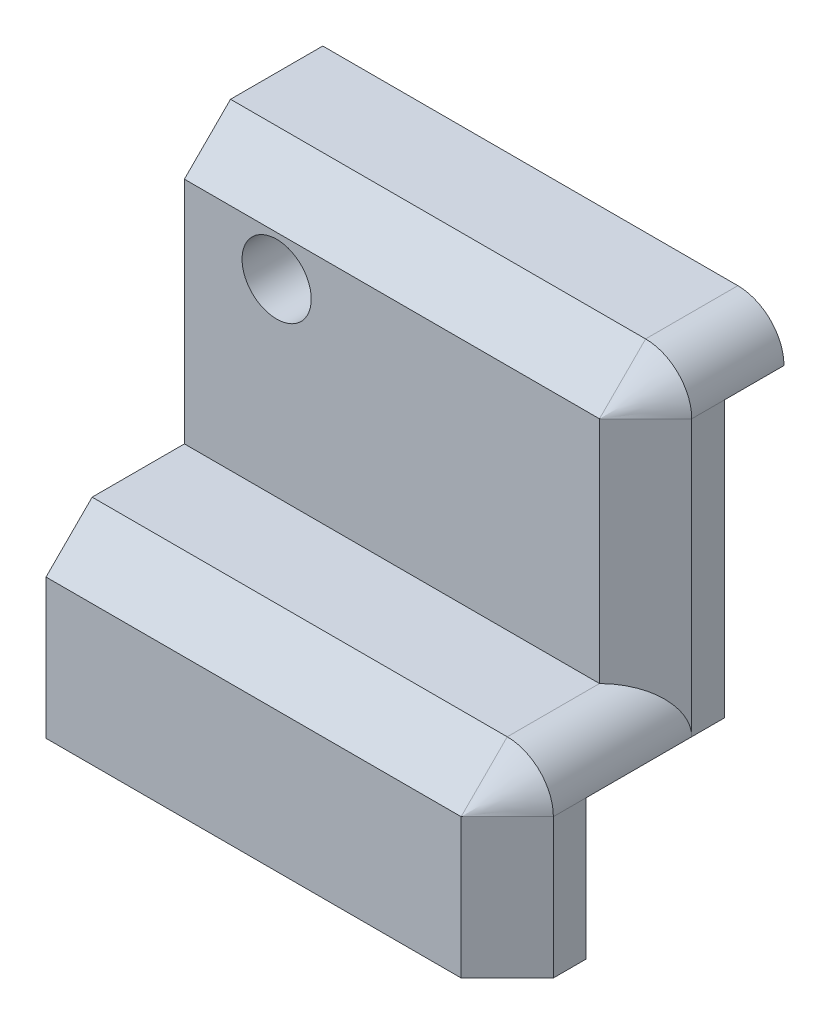
ISO-10303-21;
HEADER;
FILE_DESCRIPTION(('STEP AP214'),'2;1');
FILE_NAME('part.step','',(''),(''),'','','');
FILE_SCHEMA(('AUTOMOTIVE_DESIGN { 1 0 10303 214 1 1 1 1 }'));
ENDSEC;
DATA;
#1=APPLICATION_CONTEXT('core data for automotive mechanical design processes');
#2=APPLICATION_PROTOCOL_DEFINITION('international standard','automotive_design',2000,#1);
#3=PRODUCT_CONTEXT('',#1,'mechanical');
#4=PRODUCT('Part','Part','',(#3));
#5=PRODUCT_RELATED_PRODUCT_CATEGORY('part','',(#4));
#6=PRODUCT_DEFINITION_FORMATION('','',#4);
#7=PRODUCT_DEFINITION_CONTEXT('part definition',#1,'design');
#8=PRODUCT_DEFINITION('design','',#6,#7);
#9=PRODUCT_DEFINITION_SHAPE('','',#8);
#10=(LENGTH_UNIT() NAMED_UNIT(*) SI_UNIT(.MILLI.,.METRE.));
#11=(NAMED_UNIT(*) PLANE_ANGLE_UNIT() SI_UNIT($,.RADIAN.));
#12=(NAMED_UNIT(*) SI_UNIT($,.STERADIAN.) SOLID_ANGLE_UNIT());
#13=UNCERTAINTY_MEASURE_WITH_UNIT(LENGTH_MEASURE(1.E-05),#10,'distance_accuracy_value','');
#14=(GEOMETRIC_REPRESENTATION_CONTEXT(3) GLOBAL_UNCERTAINTY_ASSIGNED_CONTEXT((#13)) GLOBAL_UNIT_ASSIGNED_CONTEXT((#10,
#11,#12)) REPRESENTATION_CONTEXT('',''));
#15=CARTESIAN_POINT('',(0.,0.,0.));
#16=DIRECTION('',(0.,0.,1.));
#17=DIRECTION('',(1.,0.,0.));
#18=AXIS2_PLACEMENT_3D('',#15,#16,#17);
#19=CARTESIAN_POINT('',(0.,0.,30.));
#20=DIRECTION('',(0.,1.,0.));
#21=DIRECTION('',(0.,0.,1.));
#22=AXIS2_PLACEMENT_3D('',#19,#20,#21);
#23=PLANE('',#22);
#24=DIRECTION('',(0.707106781186547,0.,-0.707106781186549));
#25=VECTOR('',#24,1.);
#26=CARTESIAN_POINT('',(86.4644660940673,0.,56.4644660940673));
#27=LINE('',#26,#25);
#28=CARTESIAN_POINT('',(100.,0.,42.9289321881345));
#29=VERTEX_POINT('',#28);
#30=CARTESIAN_POINT('',(87.9289321881345,0.,55.));
#31=VERTEX_POINT('',#30);
#32=EDGE_CURVE('E383',#29,#31,#27,.F.);
#33=ORIENTED_EDGE('',*,*,#32,.F.);
#34=DIRECTION('',(0.,0.,-1.));
#35=VECTOR('',#34,1.);
#36=CARTESIAN_POINT('',(100.,0.,30.));
#37=LINE('',#36,#35);
#38=CARTESIAN_POINT('',(100.,0.,50.));
#39=VERTEX_POINT('',#38);
#40=EDGE_CURVE('E322',#39,#29,#37,.T.);
#41=ORIENTED_EDGE('',*,*,#40,.F.);
#42=DIRECTION('',(0.707106781186547,0.,-0.707106781186549));
#43=VECTOR('',#42,1.);
#44=CARTESIAN_POINT('',(90.,0.,60.));
#45=LINE('',#44,#43);
#46=CARTESIAN_POINT('',(90.,0.,60.));
#47=VERTEX_POINT('',#46);
#48=EDGE_CURVE('E254',#39,#47,#45,.F.);
#49=ORIENTED_EDGE('',*,*,#48,.T.);
#50=DIRECTION('',(1.,0.,0.));
#51=VECTOR('',#50,1.);
#52=CARTESIAN_POINT('',(0.,0.,60.));
#53=LINE('',#52,#51);
#54=CARTESIAN_POINT('',(0.,0.,60.));
#55=VERTEX_POINT('',#54);
#56=EDGE_CURVE('E303',#55,#47,#53,.T.);
#57=ORIENTED_EDGE('',*,*,#56,.F.);
#58=DIRECTION('',(0.,0.,-1.));
#59=VECTOR('',#58,1.);
#60=CARTESIAN_POINT('',(0.,0.,30.));
#61=LINE('',#60,#59);
#62=CARTESIAN_POINT('',(0.,0.,0.));
#63=VERTEX_POINT('',#62);
#64=EDGE_CURVE('E324',#55,#63,#61,.T.);
#65=ORIENTED_EDGE('',*,*,#64,.T.);
#66=DIRECTION('',(1.,0.,0.));
#67=VECTOR('',#66,1.);
#68=CARTESIAN_POINT('',(0.,0.,0.));
#69=LINE('',#68,#67);
#70=CARTESIAN_POINT('',(5.,0.,0.));
#71=VERTEX_POINT('',#70);
#72=EDGE_CURVE('E317',#63,#71,#69,.T.);
#73=ORIENTED_EDGE('',*,*,#72,.T.);
#74=DIRECTION('',(0.,0.,-1.));
#75=VECTOR('',#74,1.);
#76=CARTESIAN_POINT('',(5.,0.,30.));
#77=LINE('',#76,#75);
#78=CARTESIAN_POINT('',(5.,0.,55.));
#79=VERTEX_POINT('',#78);
#80=EDGE_CURVE('E62',#79,#71,#77,.T.);
#81=ORIENTED_EDGE('',*,*,#80,.F.);
#82=DIRECTION('',(1.,0.,0.));
#83=VECTOR('',#82,1.);
#84=CARTESIAN_POINT('',(0.,0.,55.));
#85=LINE('',#84,#83);
#86=EDGE_CURVE('E385',#79,#31,#85,.T.);
#87=ORIENTED_EDGE('',*,*,#86,.T.);
#88=EDGE_LOOP('',(#33,#41,#49,#57,#65,#73,#81,#87));
#89=FACE_BOUND('',#88,.T.);
#90=ADVANCED_FACE('F44',(#89),#23,.F.);
#91=CARTESIAN_POINT('',(100.,0.,30.));
#92=DIRECTION('',(-1.,0.,0.));
#93=DIRECTION('',(0.,0.,1.));
#94=AXIS2_PLACEMENT_3D('',#91,#92,#93);
#95=PLANE('',#94);
#96=DIRECTION('',(0.,1.,0.));
#97=VECTOR('',#96,1.);
#98=CARTESIAN_POINT('',(100.,0.,42.9289321881345));
#99=LINE('',#98,#97);
#100=CARTESIAN_POINT('',(100.,30.290520378338,42.9289321881345));
#101=VERTEX_POINT('',#100);
#102=EDGE_CURVE('E390',#101,#29,#99,.F.);
#103=ORIENTED_EDGE('',*,*,#102,.F.);
#104=DIRECTION('',(0.,0.,-1.));
#105=VECTOR('',#104,1.);
#106=CARTESIAN_POINT('',(100.,30.290520378338,30.));
#107=LINE('',#106,#105);
#108=CARTESIAN_POINT('',(100.,30.290520378338,50.));
#109=VERTEX_POINT('',#108);
#110=EDGE_CURVE('E236',#101,#109,#107,.F.);
#111=ORIENTED_EDGE('',*,*,#110,.T.);
#112=DIRECTION('',(0.,-1.,0.));
#113=VECTOR('',#112,1.);
#114=CARTESIAN_POINT('',(100.,0.,50.));
#115=LINE('',#114,#113);
#116=EDGE_CURVE('E252',#109,#39,#115,.T.);
#117=ORIENTED_EDGE('',*,*,#116,.T.);
#118=ORIENTED_EDGE('',*,*,#40,.T.);
#119=EDGE_LOOP('',(#103,#111,#117,#118));
#120=FACE_BOUND('',#119,.T.);
#121=ADVANCED_FACE('F380',(#120),#95,.F.);
#122=DIRECTION('',(0.,0.,-1.));
#123=VECTOR('',#122,1.);
#124=CARTESIAN_POINT('',(100.,30.290520378338,30.));
#125=LINE('',#124,#123);
#126=CARTESIAN_POINT('',(100.,30.290520378338,12.9289321881345));
#127=VERTEX_POINT('',#126);
#128=CARTESIAN_POINT('',(100.,30.290520378338,20.));
#129=VERTEX_POINT('',#128);
#130=EDGE_CURVE('E352',#127,#129,#125,.F.);
#131=ORIENTED_EDGE('',*,*,#130,.F.);
#132=DIRECTION('',(0.,1.,0.));
#133=VECTOR('',#132,1.);
#134=CARTESIAN_POINT('',(100.,0.,12.9289321881345));
#135=LINE('',#134,#133);
#136=CARTESIAN_POINT('',(100.,90.,12.9289321881345));
#137=VERTEX_POINT('',#136);
#138=EDGE_CURVE('E353',#137,#127,#135,.F.);
#139=ORIENTED_EDGE('',*,*,#138,.F.);
#140=DIRECTION('',(0.,0.,-1.));
#141=VECTOR('',#140,1.);
#142=CARTESIAN_POINT('',(100.,90.,30.));
#143=LINE('',#142,#141);
#144=CARTESIAN_POINT('',(100.,90.,20.));
#145=VERTEX_POINT('',#144);
#146=EDGE_CURVE('E235',#137,#145,#143,.F.);
#147=ORIENTED_EDGE('',*,*,#146,.T.);
#148=DIRECTION('',(0.,-1.,0.));
#149=VECTOR('',#148,1.);
#150=CARTESIAN_POINT('',(100.,0.,20.));
#151=LINE('',#150,#149);
#152=EDGE_CURVE('E249',#145,#129,#151,.T.);
#153=ORIENTED_EDGE('',*,*,#152,.T.);
#154=EDGE_LOOP('',(#131,#139,#147,#153));
#155=FACE_BOUND('',#154,.T.);
#156=ADVANCED_FACE('F350',(#155),#95,.F.);
#157=CARTESIAN_POINT('',(0.,0.,0.));
#158=DIRECTION('',(0.,0.,-1.));
#159=DIRECTION('',(-1.,0.,0.));
#160=AXIS2_PLACEMENT_3D('',#157,#158,#159);
#161=PLANE('',#160);
#162=CARTESIAN_POINT('',(20.,81.2240100063522,0.));
#163=DIRECTION('',(0.,0.,-1.));
#164=DIRECTION('',(-1.,0.,0.));
#165=AXIS2_PLACEMENT_3D('',#162,#163,#164);
#166=CIRCLE('',#165,12.5);
#167=CARTESIAN_POINT('',(7.5,81.2240100063522,0.));
#168=VERTEX_POINT('',#167);
#169=EDGE_CURVE('E403',#168,#168,#166,.F.);
#170=ORIENTED_EDGE('',*,*,#169,.F.);
#171=EDGE_LOOP('',(#170));
#172=FACE_BOUND('',#171,.T.);
#173=CARTESIAN_POINT('',(20.,81.2240100063522,0.));
#174=DIRECTION('',(0.,0.,1.));
#175=DIRECTION('',(1.,0.,0.));
#176=AXIS2_PLACEMENT_3D('',#173,#174,#175);
#177=CIRCLE('',#176,7.5);
#178=CARTESIAN_POINT('',(27.5,81.2240100063522,0.));
#179=VERTEX_POINT('',#178);
#180=EDGE_CURVE('E295',#179,#179,#177,.T.);
#181=ORIENTED_EDGE('',*,*,#180,.T.);
#182=EDGE_LOOP('',(#181));
#183=FACE_BOUND('',#182,.T.);
#184=ADVANCED_FACE('F629',(#172,#183),#161,.T.);
#185=CARTESIAN_POINT('',(0.,0.,30.));
#186=DIRECTION('',(0.,0.,-1.));
#187=DIRECTION('',(-1.,0.,0.));
#188=AXIS2_PLACEMENT_3D('',#185,#186,#187);
#189=PLANE('',#188);
#190=CARTESIAN_POINT('',(20.,81.2240100063522,30.));
#191=DIRECTION('',(0.,0.,1.));
#192=DIRECTION('',(1.,0.,0.));
#193=AXIS2_PLACEMENT_3D('',#190,#191,#192);
#194=CIRCLE('',#193,7.5);
#195=CARTESIAN_POINT('',(27.5,81.2240100063522,30.));
#196=VERTEX_POINT('',#195);
#197=EDGE_CURVE('E277',#196,#196,#194,.T.);
#198=ORIENTED_EDGE('',*,*,#197,.F.);
#199=EDGE_LOOP('',(#198));
#200=FACE_BOUND('',#199,.T.);
#201=DIRECTION('',(-1.,0.,0.));
#202=VECTOR('',#201,1.);
#203=CARTESIAN_POINT('',(0.,40.290520378338,30.));
#204=LINE('',#203,#202);
#205=CARTESIAN_POINT('',(90.,40.290520378338,30.));
#206=VERTEX_POINT('',#205);
#207=CARTESIAN_POINT('',(0.,40.290520378338,30.));
#208=VERTEX_POINT('',#207);
#209=EDGE_CURVE('E298',#206,#208,#204,.T.);
#210=ORIENTED_EDGE('',*,*,#209,.F.);
#211=DIRECTION('',(0.,1.,0.));
#212=VECTOR('',#211,1.);
#213=CARTESIAN_POINT('',(90.,0.,30.));
#214=LINE('',#213,#212);
#215=CARTESIAN_POINT('',(90.,90.,30.));
#216=VERTEX_POINT('',#215);
#217=EDGE_CURVE('E267',#206,#216,#214,.T.);
#218=ORIENTED_EDGE('',*,*,#217,.T.);
#219=DIRECTION('',(-1.,0.,0.));
#220=VECTOR('',#219,1.);
#221=CARTESIAN_POINT('',(0.,90.,30.));
#222=LINE('',#221,#220);
#223=CARTESIAN_POINT('',(0.,90.,30.));
#224=VERTEX_POINT('',#223);
#225=EDGE_CURVE('E265',#216,#224,#222,.T.);
#226=ORIENTED_EDGE('',*,*,#225,.T.);
#227=DIRECTION('',(0.,-1.,0.));
#228=VECTOR('',#227,1.);
#229=CARTESIAN_POINT('',(0.,0.,30.));
#230=LINE('',#229,#228);
#231=EDGE_CURVE('E312',#224,#208,#230,.T.);
#232=ORIENTED_EDGE('',*,*,#231,.T.);
#233=EDGE_LOOP('',(#210,#218,#226,#232));
#234=FACE_BOUND('',#233,.T.);
#235=ADVANCED_FACE('F339',(#200,#234),#189,.F.);
#236=CARTESIAN_POINT('',(0.,0.,30.));
#237=DIRECTION('',(1.,0.,0.));
#238=DIRECTION('',(0.,0.,-1.));
#239=AXIS2_PLACEMENT_3D('',#236,#237,#238);
#240=PLANE('',#239);
#241=DIRECTION('',(0.,-1.,0.));
#242=VECTOR('',#241,1.);
#243=CARTESIAN_POINT('',(0.,0.,60.));
#244=LINE('',#243,#242);
#245=CARTESIAN_POINT('',(0.,30.290520378338,60.));
#246=VERTEX_POINT('',#245);
#247=EDGE_CURVE('E301',#246,#55,#244,.T.);
#248=ORIENTED_EDGE('',*,*,#247,.F.);
#249=DIRECTION('',(0.,-0.707106781186547,0.707106781186549));
#250=VECTOR('',#249,1.);
#251=CARTESIAN_POINT('',(0.,30.290520378338,60.));
#252=LINE('',#251,#250);
#253=CARTESIAN_POINT('',(0.,40.290520378338,50.));
#254=VERTEX_POINT('',#253);
#255=EDGE_CURVE('E261',#246,#254,#252,.F.);
#256=ORIENTED_EDGE('',*,*,#255,.T.);
#257=DIRECTION('',(0.,0.,-1.));
#258=VECTOR('',#257,1.);
#259=CARTESIAN_POINT('',(0.,40.290520378338,60.));
#260=LINE('',#259,#258);
#261=EDGE_CURVE('E306',#254,#208,#260,.T.);
#262=ORIENTED_EDGE('',*,*,#261,.T.);
#263=ORIENTED_EDGE('',*,*,#231,.F.);
#264=DIRECTION('',(0.,-0.707106781186546,0.70710678118655));
#265=VECTOR('',#264,1.);
#266=CARTESIAN_POINT('',(0.,90.,30.));
#267=LINE('',#266,#265);
#268=CARTESIAN_POINT('',(0.,100.,20.));
#269=VERTEX_POINT('',#268);
#270=EDGE_CURVE('E259',#224,#269,#267,.F.);
#271=ORIENTED_EDGE('',*,*,#270,.T.);
#272=DIRECTION('',(0.,0.,-1.));
#273=VECTOR('',#272,1.);
#274=CARTESIAN_POINT('',(0.,100.,30.));
#275=LINE('',#274,#273);
#276=CARTESIAN_POINT('',(0.,100.,0.));
#277=VERTEX_POINT('',#276);
#278=EDGE_CURVE('E314',#269,#277,#275,.T.);
#279=ORIENTED_EDGE('',*,*,#278,.T.);
#280=DIRECTION('',(0.,-1.,0.));
#281=VECTOR('',#280,1.);
#282=CARTESIAN_POINT('',(0.,0.,0.));
#283=LINE('',#282,#281);
#284=EDGE_CURVE('E311',#277,#63,#283,.T.);
#285=ORIENTED_EDGE('',*,*,#284,.T.);
#286=ORIENTED_EDGE('',*,*,#64,.F.);
#287=EDGE_LOOP('',(#248,#256,#262,#263,#271,#279,#285,#286));
#288=FACE_BOUND('',#287,.T.);
#289=ADVANCED_FACE('F363',(#288),#240,.F.);
#290=CARTESIAN_POINT('',(0.,100.,30.));
#291=DIRECTION('',(0.,-1.,0.));
#292=DIRECTION('',(0.,0.,-1.));
#293=AXIS2_PLACEMENT_3D('',#290,#291,#292);
#294=PLANE('',#293);
#295=ORIENTED_EDGE('',*,*,#278,.F.);
#296=DIRECTION('',(1.,0.,0.));
#297=VECTOR('',#296,1.);
#298=CARTESIAN_POINT('',(0.,100.,20.));
#299=LINE('',#298,#297);
#300=CARTESIAN_POINT('',(90.,100.,20.));
#301=VERTEX_POINT('',#300);
#302=EDGE_CURVE('E54',#269,#301,#299,.T.);
#303=ORIENTED_EDGE('',*,*,#302,.T.);
#304=DIRECTION('',(0.,0.,-1.));
#305=VECTOR('',#304,1.);
#306=CARTESIAN_POINT('',(90.,100.,30.));
#307=LINE('',#306,#305);
#308=CARTESIAN_POINT('',(90.,100.,0.));
#309=VERTEX_POINT('',#308);
#310=EDGE_CURVE('E230',#301,#309,#307,.T.);
#311=ORIENTED_EDGE('',*,*,#310,.T.);
#312=DIRECTION('',(-1.,0.,0.));
#313=VECTOR('',#312,1.);
#314=CARTESIAN_POINT('',(0.,100.,0.));
#315=LINE('',#314,#313);
#316=EDGE_CURVE('E227',#309,#277,#315,.T.);
#317=ORIENTED_EDGE('',*,*,#316,.T.);
#318=EDGE_LOOP('',(#295,#303,#311,#317));
#319=FACE_BOUND('',#318,.T.);
#320=ADVANCED_FACE('F544',(#319),#294,.F.);
#321=DIRECTION('',(-1.,0.,0.));
#322=VECTOR('',#321,1.);
#323=CARTESIAN_POINT('',(100.,90.,0.));
#324=LINE('',#323,#322);
#325=CARTESIAN_POINT('',(95.,90.,0.));
#326=VERTEX_POINT('',#325);
#327=CARTESIAN_POINT('',(100.,90.,0.));
#328=VERTEX_POINT('',#327);
#329=EDGE_CURVE('E208',#326,#328,#324,.F.);
#330=ORIENTED_EDGE('',*,*,#329,.F.);
#331=CARTESIAN_POINT('',(90.,90.,0.));
#332=DIRECTION('',(0.,0.,-1.));
#333=DIRECTION('',(-1.,0.,0.));
#334=AXIS2_PLACEMENT_3D('',#331,#332,#333);
#335=CIRCLE('',#334,5.);
#336=CARTESIAN_POINT('',(90.,95.,0.));
#337=VERTEX_POINT('',#336);
#338=EDGE_CURVE('E445',#337,#326,#335,.T.);
#339=ORIENTED_EDGE('',*,*,#338,.F.);
#340=DIRECTION('',(-1.,0.,0.));
#341=VECTOR('',#340,1.);
#342=CARTESIAN_POINT('',(0.,95.,0.));
#343=LINE('',#342,#341);
#344=CARTESIAN_POINT('',(5.,95.,0.));
#345=VERTEX_POINT('',#344);
#346=EDGE_CURVE('E430',#337,#345,#343,.T.);
#347=ORIENTED_EDGE('',*,*,#346,.T.);
#348=DIRECTION('',(0.,-1.,0.));
#349=VECTOR('',#348,1.);
#350=CARTESIAN_POINT('',(5.,0.,0.));
#351=LINE('',#350,#349);
#352=EDGE_CURVE('E437',#345,#71,#351,.T.);
#353=ORIENTED_EDGE('',*,*,#352,.T.);
#354=ORIENTED_EDGE('',*,*,#72,.F.);
#355=ORIENTED_EDGE('',*,*,#284,.F.);
#356=ORIENTED_EDGE('',*,*,#316,.F.);
#357=CARTESIAN_POINT('',(90.,90.,0.));
#358=DIRECTION('',(0.,0.,-1.));
#359=DIRECTION('',(-1.,0.,0.));
#360=AXIS2_PLACEMENT_3D('',#357,#358,#359);
#361=CIRCLE('',#360,10.);
#362=EDGE_CURVE('E223',#309,#328,#361,.T.);
#363=ORIENTED_EDGE('',*,*,#362,.T.);
#364=EDGE_LOOP('',(#330,#339,#347,#353,#354,#355,#356,#363));
#365=FACE_BOUND('',#364,.T.);
#366=ADVANCED_FACE('F224',(#365),#161,.T.);
#367=CARTESIAN_POINT('',(0.,40.290520378338,60.));
#368=DIRECTION('',(0.,-1.,0.));
#369=DIRECTION('',(0.,0.,-1.));
#370=AXIS2_PLACEMENT_3D('',#367,#368,#369);
#371=PLANE('',#370);
#372=ORIENTED_EDGE('',*,*,#261,.F.);
#373=DIRECTION('',(1.,0.,0.));
#374=VECTOR('',#373,1.);
#375=CARTESIAN_POINT('',(0.,40.290520378338,50.));
#376=LINE('',#375,#374);
#377=CARTESIAN_POINT('',(90.,40.290520378338,50.));
#378=VERTEX_POINT('',#377);
#379=EDGE_CURVE('E263',#254,#378,#376,.T.);
#380=ORIENTED_EDGE('',*,*,#379,.T.);
#381=DIRECTION('',(0.,0.,-1.));
#382=VECTOR('',#381,1.);
#383=CARTESIAN_POINT('',(90.,40.290520378338,60.));
#384=LINE('',#383,#382);
#385=EDGE_CURVE('E240',#378,#206,#384,.T.);
#386=ORIENTED_EDGE('',*,*,#385,.T.);
#387=ORIENTED_EDGE('',*,*,#209,.T.);
#388=EDGE_LOOP('',(#372,#380,#386,#387));
#389=FACE_BOUND('',#388,.T.);
#390=ADVANCED_FACE('F334',(#389),#371,.F.);
#391=CARTESIAN_POINT('',(0.,0.,60.));
#392=DIRECTION('',(0.,0.,-1.));
#393=DIRECTION('',(-1.,0.,0.));
#394=AXIS2_PLACEMENT_3D('',#391,#392,#393);
#395=PLANE('',#394);
#396=ORIENTED_EDGE('',*,*,#56,.T.);
#397=DIRECTION('',(0.,1.,0.));
#398=VECTOR('',#397,1.);
#399=CARTESIAN_POINT('',(90.,0.,60.));
#400=LINE('',#399,#398);
#401=CARTESIAN_POINT('',(90.,30.290520378338,60.));
#402=VERTEX_POINT('',#401);
#403=EDGE_CURVE('E246',#47,#402,#400,.T.);
#404=ORIENTED_EDGE('',*,*,#403,.T.);
#405=DIRECTION('',(-1.,0.,0.));
#406=VECTOR('',#405,1.);
#407=CARTESIAN_POINT('',(0.,30.290520378338,60.));
#408=LINE('',#407,#406);
#409=EDGE_CURVE('E229',#402,#246,#408,.T.);
#410=ORIENTED_EDGE('',*,*,#409,.T.);
#411=ORIENTED_EDGE('',*,*,#247,.T.);
#412=EDGE_LOOP('',(#396,#404,#410,#411));
#413=FACE_BOUND('',#412,.T.);
#414=ADVANCED_FACE('F607',(#413),#395,.F.);
#415=CARTESIAN_POINT('',(20.,81.2240100063522,0.));
#416=DIRECTION('',(0.,0.,1.));
#417=DIRECTION('',(1.,0.,0.));
#418=AXIS2_PLACEMENT_3D('',#415,#416,#417);
#419=CYLINDRICAL_SURFACE('',#418,7.5);
#420=ORIENTED_EDGE('',*,*,#180,.F.);
#421=EDGE_LOOP('',(#420));
#422=FACE_BOUND('',#421,.T.);
#423=ORIENTED_EDGE('',*,*,#197,.T.);
#424=EDGE_LOOP('',(#423));
#425=FACE_BOUND('',#424,.T.);
#426=ADVANCED_FACE('F547',(#422,#425),#419,.F.);
#427=CARTESIAN_POINT('',(90.,30.290520378338,60.));
#428=DIRECTION('',(0.,0.,-1.));
#429=DIRECTION('',(-1.,0.,0.));
#430=AXIS2_PLACEMENT_3D('',#427,#428,#429);
#431=CYLINDRICAL_SURFACE('',#430,10.);
#432=ORIENTED_EDGE('',*,*,#385,.F.);
#433=CARTESIAN_POINT('',(90.,30.290520378338,50.));
#434=DIRECTION('',(0.,0.,-1.));
#435=DIRECTION('',(-1.,0.,0.));
#436=AXIS2_PLACEMENT_3D('',#433,#434,#435);
#437=CIRCLE('',#436,10.);
#438=EDGE_CURVE('E256',#378,#109,#437,.T.);
#439=ORIENTED_EDGE('',*,*,#438,.T.);
#440=ORIENTED_EDGE('',*,*,#110,.F.);
#441=EDGE_CURVE('E238',#129,#101,#107,.F.);
#442=ORIENTED_EDGE('',*,*,#441,.F.);
#443=CARTESIAN_POINT('',(90.,30.290520378338,30.));
#444=DIRECTION('',(-0.70710678118655,0.,-0.707106781186546));
#445=DIRECTION('',(0.707106781186546,0.,-0.70710678118655));
#446=AXIS2_PLACEMENT_3D('',#443,#444,#445);
#447=ELLIPSE('',#446,14.142135623731,10.);
#448=EDGE_CURVE('E11',#129,#206,#447,.F.);
#449=ORIENTED_EDGE('',*,*,#448,.T.);
#450=EDGE_LOOP('',(#432,#439,#440,#442,#449));
#451=FACE_BOUND('',#450,.T.);
#452=ADVANCED_FACE('F344',(#451),#431,.T.);
#453=CARTESIAN_POINT('',(90.,90.,30.));
#454=DIRECTION('',(0.,0.,-1.));
#455=DIRECTION('',(-1.,0.,0.));
#456=AXIS2_PLACEMENT_3D('',#453,#454,#455);
#457=CYLINDRICAL_SURFACE('',#456,10.);
#458=ORIENTED_EDGE('',*,*,#310,.F.);
#459=CARTESIAN_POINT('',(90.,90.,20.));
#460=DIRECTION('',(0.,0.,-1.));
#461=DIRECTION('',(-1.,0.,0.));
#462=AXIS2_PLACEMENT_3D('',#459,#460,#461);
#463=CIRCLE('',#462,10.);
#464=EDGE_CURVE('E270',#301,#145,#463,.T.);
#465=ORIENTED_EDGE('',*,*,#464,.T.);
#466=ORIENTED_EDGE('',*,*,#146,.F.);
#467=EDGE_CURVE('E212',#328,#137,#143,.F.);
#468=ORIENTED_EDGE('',*,*,#467,.F.);
#469=ORIENTED_EDGE('',*,*,#362,.F.);
#470=EDGE_LOOP('',(#458,#465,#466,#468,#469));
#471=FACE_BOUND('',#470,.T.);
#472=ADVANCED_FACE('F233',(#471),#457,.T.);
#473=CARTESIAN_POINT('',(0.,30.290520378338,60.));
#474=DIRECTION('',(0.,-0.707106781186548,-0.707106781186546));
#475=DIRECTION('',(-1.,0.,0.));
#476=AXIS2_PLACEMENT_3D('',#473,#474,#475);
#477=PLANE('',#476);
#478=DIRECTION('',(0.,-0.707106781186546,0.707106781186548));
#479=VECTOR('',#478,1.);
#480=CARTESIAN_POINT('',(90.,40.290520378338,50.));
#481=LINE('',#480,#479);
#482=EDGE_CURVE('E275',#378,#402,#481,.T.);
#483=ORIENTED_EDGE('',*,*,#482,.F.);
#484=ORIENTED_EDGE('',*,*,#379,.F.);
#485=ORIENTED_EDGE('',*,*,#255,.F.);
#486=ORIENTED_EDGE('',*,*,#409,.F.);
#487=EDGE_LOOP('',(#483,#484,#485,#486));
#488=FACE_BOUND('',#487,.T.);
#489=ADVANCED_FACE('F366',(#488),#477,.F.);
#490=CARTESIAN_POINT('',(90.,30.290520378338,50.));
#491=DIRECTION('',(0.,0.,-1.));
#492=DIRECTION('',(-1.,0.,0.));
#493=AXIS2_PLACEMENT_3D('',#490,#491,#492);
#494=CONICAL_SURFACE('',#493,9.99999999999999,0.785398163397447);
#495=ORIENTED_EDGE('',*,*,#438,.F.);
#496=ORIENTED_EDGE('',*,*,#482,.T.);
#497=DIRECTION('',(-0.707106781186546,0.,0.707106781186548));
#498=VECTOR('',#497,1.);
#499=CARTESIAN_POINT('',(100.,30.290520378338,50.));
#500=LINE('',#499,#498);
#501=EDGE_CURVE('E273',#109,#402,#500,.T.);
#502=ORIENTED_EDGE('',*,*,#501,.F.);
#503=EDGE_LOOP('',(#495,#496,#502));
#504=FACE_BOUND('',#503,.T.);
#505=ADVANCED_FACE('F371',(#504),#494,.T.);
#506=CARTESIAN_POINT('',(90.,0.,60.));
#507=DIRECTION('',(-0.707106781186548,0.,-0.707106781186546));
#508=DIRECTION('',(0.,1.,0.));
#509=AXIS2_PLACEMENT_3D('',#506,#507,#508);
#510=PLANE('',#509);
#511=ORIENTED_EDGE('',*,*,#48,.F.);
#512=ORIENTED_EDGE('',*,*,#116,.F.);
#513=ORIENTED_EDGE('',*,*,#501,.T.);
#514=ORIENTED_EDGE('',*,*,#403,.F.);
#515=EDGE_LOOP('',(#511,#512,#513,#514));
#516=FACE_BOUND('',#515,.T.);
#517=ADVANCED_FACE('F375',(#516),#510,.F.);
#518=CARTESIAN_POINT('',(0.,90.,30.));
#519=DIRECTION('',(0.,-0.70710678118655,-0.707106781186546));
#520=DIRECTION('',(-1.,0.,0.));
#521=AXIS2_PLACEMENT_3D('',#518,#519,#520);
#522=PLANE('',#521);
#523=DIRECTION('',(0.,-0.707106781186546,0.70710678118655));
#524=VECTOR('',#523,1.);
#525=CARTESIAN_POINT('',(90.,100.,20.));
#526=LINE('',#525,#524);
#527=EDGE_CURVE('E49',#301,#216,#526,.T.);
#528=ORIENTED_EDGE('',*,*,#527,.F.);
#529=ORIENTED_EDGE('',*,*,#302,.F.);
#530=ORIENTED_EDGE('',*,*,#270,.F.);
#531=ORIENTED_EDGE('',*,*,#225,.F.);
#532=EDGE_LOOP('',(#528,#529,#530,#531));
#533=FACE_BOUND('',#532,.T.);
#534=ADVANCED_FACE('F47',(#533),#522,.F.);
#535=CARTESIAN_POINT('',(90.,90.,20.));
#536=DIRECTION('',(0.,0.,-1.));
#537=DIRECTION('',(-1.,0.,0.));
#538=AXIS2_PLACEMENT_3D('',#535,#536,#537);
#539=CONICAL_SURFACE('',#538,9.99999999999999,0.785398163397446);
#540=ORIENTED_EDGE('',*,*,#464,.F.);
#541=ORIENTED_EDGE('',*,*,#527,.T.);
#542=DIRECTION('',(-0.707106781186546,0.,0.70710678118655));
#543=VECTOR('',#542,1.);
#544=CARTESIAN_POINT('',(100.,90.,20.));
#545=LINE('',#544,#543);
#546=EDGE_CURVE('E278',#145,#216,#545,.T.);
#547=ORIENTED_EDGE('',*,*,#546,.F.);
#548=EDGE_LOOP('',(#540,#541,#547));
#549=FACE_BOUND('',#548,.T.);
#550=ADVANCED_FACE('F357',(#549),#539,.T.);
#551=CARTESIAN_POINT('',(90.,0.,30.));
#552=DIRECTION('',(-0.70710678118655,0.,-0.707106781186546));
#553=DIRECTION('',(0.,1.,0.));
#554=AXIS2_PLACEMENT_3D('',#551,#552,#553);
#555=PLANE('',#554);
#556=ORIENTED_EDGE('',*,*,#448,.F.);
#557=ORIENTED_EDGE('',*,*,#152,.F.);
#558=ORIENTED_EDGE('',*,*,#546,.T.);
#559=ORIENTED_EDGE('',*,*,#217,.F.);
#560=EDGE_LOOP('',(#556,#557,#558,#559));
#561=FACE_BOUND('',#560,.T.);
#562=ADVANCED_FACE('F342',(#561),#555,.F.);
#563=CARTESIAN_POINT('',(100.,90.,30.));
#564=DIRECTION('',(0.,1.,0.));
#565=DIRECTION('',(0.,0.,-1.));
#566=AXIS2_PLACEMENT_3D('',#563,#564,#565);
#567=PLANE('',#566);
#568=ORIENTED_EDGE('',*,*,#467,.T.);
#569=DIRECTION('',(-0.707106781186546,0.,0.70710678118655));
#570=VECTOR('',#569,1.);
#571=CARTESIAN_POINT('',(91.4644660940672,90.,21.4644660940673));
#572=LINE('',#571,#570);
#573=CARTESIAN_POINT('',(95.,90.,17.9289321881345));
#574=VERTEX_POINT('',#573);
#575=EDGE_CURVE('E219',#574,#137,#572,.F.);
#576=ORIENTED_EDGE('',*,*,#575,.F.);
#577=DIRECTION('',(0.,0.,-1.));
#578=VECTOR('',#577,1.);
#579=CARTESIAN_POINT('',(95.,90.,30.));
#580=LINE('',#579,#578);
#581=EDGE_CURVE('E215',#326,#574,#580,.F.);
#582=ORIENTED_EDGE('',*,*,#581,.F.);
#583=ORIENTED_EDGE('',*,*,#329,.T.);
#584=EDGE_LOOP('',(#568,#576,#582,#583));
#585=FACE_BOUND('',#584,.T.);
#586=ADVANCED_FACE('F210',(#585),#567,.F.);
#587=CARTESIAN_POINT('',(100.,30.290520378338,30.));
#588=DIRECTION('',(0.,1.,0.));
#589=DIRECTION('',(0.,0.,-1.));
#590=AXIS2_PLACEMENT_3D('',#587,#588,#589);
#591=PLANE('',#590);
#592=ORIENTED_EDGE('',*,*,#130,.T.);
#593=ORIENTED_EDGE('',*,*,#441,.T.);
#594=DIRECTION('',(-0.707106781186547,0.,0.707106781186549));
#595=VECTOR('',#594,1.);
#596=CARTESIAN_POINT('',(106.464466094067,30.290520378338,36.4644660940672));
#597=LINE('',#596,#595);
#598=CARTESIAN_POINT('',(95.,30.290520378338,47.9289321881345));
#599=VERTEX_POINT('',#598);
#600=EDGE_CURVE('E474',#599,#101,#597,.F.);
#601=ORIENTED_EDGE('',*,*,#600,.F.);
#602=DIRECTION('',(0.,0.,-1.));
#603=VECTOR('',#602,1.);
#604=CARTESIAN_POINT('',(95.,30.290520378338,60.));
#605=LINE('',#604,#603);
#606=CARTESIAN_POINT('',(95.,30.290520378338,17.9289321881345));
#607=VERTEX_POINT('',#606);
#608=EDGE_CURVE('E456',#607,#599,#605,.F.);
#609=ORIENTED_EDGE('',*,*,#608,.F.);
#610=DIRECTION('',(-0.707106781186546,0.,0.70710678118655));
#611=VECTOR('',#610,1.);
#612=CARTESIAN_POINT('',(91.4644660940672,30.290520378338,21.4644660940673));
#613=LINE('',#612,#611);
#614=EDGE_CURVE('E476',#607,#127,#613,.F.);
#615=ORIENTED_EDGE('',*,*,#614,.T.);
#616=EDGE_LOOP('',(#592,#593,#601,#609,#615));
#617=FACE_BOUND('',#616,.T.);
#618=ADVANCED_FACE('F484',(#617),#591,.F.);
#619=CARTESIAN_POINT('',(0.,0.,25.));
#620=DIRECTION('',(0.,0.,-1.));
#621=DIRECTION('',(-1.,0.,0.));
#622=AXIS2_PLACEMENT_3D('',#619,#620,#621);
#623=PLANE('',#622);
#624=DIRECTION('',(1.,0.,0.));
#625=VECTOR('',#624,1.);
#626=CARTESIAN_POINT('',(0.,87.9289321881345,25.));
#627=LINE('',#626,#625);
#628=CARTESIAN_POINT('',(87.9289321881345,87.9289321881345,25.));
#629=VERTEX_POINT('',#628);
#630=CARTESIAN_POINT('',(30.5495980272351,87.9289321881345,25.));
#631=VERTEX_POINT('',#630);
#632=EDGE_CURVE('E425',#629,#631,#627,.F.);
#633=ORIENTED_EDGE('',*,*,#632,.F.);
#634=DIRECTION('',(0.,-1.,0.));
#635=VECTOR('',#634,1.);
#636=CARTESIAN_POINT('',(87.9289321881345,0.,25.));
#637=LINE('',#636,#635);
#638=CARTESIAN_POINT('',(87.9289321881345,35.290520378338,25.));
#639=VERTEX_POINT('',#638);
#640=EDGE_CURVE('E421',#639,#629,#637,.F.);
#641=ORIENTED_EDGE('',*,*,#640,.F.);
#642=DIRECTION('',(-1.,0.,0.));
#643=VECTOR('',#642,1.);
#644=CARTESIAN_POINT('',(0.,35.290520378338,25.));
#645=LINE('',#644,#643);
#646=CARTESIAN_POINT('',(5.,35.290520378338,25.));
#647=VERTEX_POINT('',#646);
#648=EDGE_CURVE('E405',#639,#647,#645,.T.);
#649=ORIENTED_EDGE('',*,*,#648,.T.);
#650=DIRECTION('',(0.,-1.,0.));
#651=VECTOR('',#650,1.);
#652=CARTESIAN_POINT('',(5.,0.,25.));
#653=LINE('',#652,#651);
#654=CARTESIAN_POINT('',(5.,87.9289321881345,25.));
#655=VERTEX_POINT('',#654);
#656=EDGE_CURVE('E428',#655,#647,#653,.T.);
#657=ORIENTED_EDGE('',*,*,#656,.F.);
#658=CARTESIAN_POINT('',(9.45040197276485,87.9289321881345,25.));
#659=VERTEX_POINT('',#658);
#660=EDGE_CURVE('E427',#659,#655,#627,.F.);
#661=ORIENTED_EDGE('',*,*,#660,.F.);
#662=CARTESIAN_POINT('',(20.,81.2240100063522,25.));
#663=DIRECTION('',(0.,0.,-1.));
#664=DIRECTION('',(-1.,0.,0.));
#665=AXIS2_PLACEMENT_3D('',#662,#663,#664);
#666=CIRCLE('',#665,12.5);
#667=EDGE_CURVE('E406',#659,#631,#666,.F.);
#668=ORIENTED_EDGE('',*,*,#667,.T.);
#669=EDGE_LOOP('',(#633,#641,#649,#657,#661,#668));
#670=FACE_BOUND('',#669,.T.);
#671=ADVANCED_FACE('F522',(#670),#623,.T.);
#672=CARTESIAN_POINT('',(5.,0.,30.));
#673=DIRECTION('',(1.,0.,0.));
#674=DIRECTION('',(0.,0.,-1.));
#675=AXIS2_PLACEMENT_3D('',#672,#673,#674);
#676=PLANE('',#675);
#677=DIRECTION('',(0.,-1.,0.));
#678=VECTOR('',#677,1.);
#679=CARTESIAN_POINT('',(5.,0.,55.));
#680=LINE('',#679,#678);
#681=CARTESIAN_POINT('',(5.,28.2194525664726,55.));
#682=VERTEX_POINT('',#681);
#683=EDGE_CURVE('E400',#682,#79,#680,.T.);
#684=ORIENTED_EDGE('',*,*,#683,.T.);
#685=ORIENTED_EDGE('',*,*,#80,.T.);
#686=ORIENTED_EDGE('',*,*,#352,.F.);
#687=DIRECTION('',(0.,0.,-1.));
#688=VECTOR('',#687,1.);
#689=CARTESIAN_POINT('',(5.,95.,30.));
#690=LINE('',#689,#688);
#691=CARTESIAN_POINT('',(5.,95.,17.9289321881345));
#692=VERTEX_POINT('',#691);
#693=EDGE_CURVE('E402',#692,#345,#690,.T.);
#694=ORIENTED_EDGE('',*,*,#693,.F.);
#695=DIRECTION('',(0.,-0.707106781186546,0.70710678118655));
#696=VECTOR('',#695,1.);
#697=CARTESIAN_POINT('',(5.,86.4644660940673,26.4644660940673));
#698=LINE('',#697,#696);
#699=EDGE_CURVE('E393',#655,#692,#698,.F.);
#700=ORIENTED_EDGE('',*,*,#699,.F.);
#701=ORIENTED_EDGE('',*,*,#656,.T.);
#702=DIRECTION('',(0.,0.,-1.));
#703=VECTOR('',#702,1.);
#704=CARTESIAN_POINT('',(5.,35.290520378338,30.));
#705=LINE('',#704,#703);
#706=CARTESIAN_POINT('',(5.,35.290520378338,47.9289321881345));
#707=VERTEX_POINT('',#706);
#708=EDGE_CURVE('E399',#707,#647,#705,.T.);
#709=ORIENTED_EDGE('',*,*,#708,.F.);
#710=DIRECTION('',(0.,-0.707106781186547,0.707106781186549));
#711=VECTOR('',#710,1.);
#712=CARTESIAN_POINT('',(5.,26.7549864724053,56.4644660940673));
#713=LINE('',#712,#711);
#714=EDGE_CURVE('E432',#682,#707,#713,.F.);
#715=ORIENTED_EDGE('',*,*,#714,.F.);
#716=EDGE_LOOP('',(#684,#685,#686,#694,#700,#701,#709,#715));
#717=FACE_BOUND('',#716,.T.);
#718=ADVANCED_FACE('F519',(#717),#676,.T.);
#719=CARTESIAN_POINT('',(0.,95.,30.));
#720=DIRECTION('',(0.,-1.,0.));
#721=DIRECTION('',(0.,0.,-1.));
#722=AXIS2_PLACEMENT_3D('',#719,#720,#721);
#723=PLANE('',#722);
#724=ORIENTED_EDGE('',*,*,#693,.T.);
#725=ORIENTED_EDGE('',*,*,#346,.F.);
#726=DIRECTION('',(0.,0.,-1.));
#727=VECTOR('',#726,1.);
#728=CARTESIAN_POINT('',(90.,95.,30.));
#729=LINE('',#728,#727);
#730=CARTESIAN_POINT('',(90.,95.,17.9289321881345));
#731=VERTEX_POINT('',#730);
#732=EDGE_CURVE('E443',#731,#337,#729,.T.);
#733=ORIENTED_EDGE('',*,*,#732,.F.);
#734=DIRECTION('',(-1.,0.,0.));
#735=VECTOR('',#734,1.);
#736=CARTESIAN_POINT('',(0.,95.,17.9289321881345));
#737=LINE('',#736,#735);
#738=EDGE_CURVE('E440',#692,#731,#737,.F.);
#739=ORIENTED_EDGE('',*,*,#738,.F.);
#740=EDGE_LOOP('',(#724,#725,#733,#739));
#741=FACE_BOUND('',#740,.T.);
#742=ADVANCED_FACE('F518',(#741),#723,.T.);
#743=CARTESIAN_POINT('',(0.,35.290520378338,60.));
#744=DIRECTION('',(0.,-1.,0.));
#745=DIRECTION('',(0.,0.,-1.));
#746=AXIS2_PLACEMENT_3D('',#743,#744,#745);
#747=PLANE('',#746);
#748=ORIENTED_EDGE('',*,*,#708,.T.);
#749=ORIENTED_EDGE('',*,*,#648,.F.);
#750=DIRECTION('',(-0.707106781186546,0.,0.70710678118655));
#751=VECTOR('',#750,1.);
#752=CARTESIAN_POINT('',(86.4644660940673,35.290520378338,26.4644660940673));
#753=LINE('',#752,#751);
#754=CARTESIAN_POINT('',(90.,35.290520378338,22.9289321881345));
#755=VERTEX_POINT('',#754);
#756=EDGE_CURVE('E291',#639,#755,#753,.F.);
#757=ORIENTED_EDGE('',*,*,#756,.T.);
#758=DIRECTION('',(0.,0.,-1.));
#759=VECTOR('',#758,1.);
#760=CARTESIAN_POINT('',(90.,35.290520378338,60.));
#761=LINE('',#760,#759);
#762=CARTESIAN_POINT('',(90.,35.290520378338,47.9289321881345));
#763=VERTEX_POINT('',#762);
#764=EDGE_CURVE('E401',#763,#755,#761,.T.);
#765=ORIENTED_EDGE('',*,*,#764,.F.);
#766=DIRECTION('',(-1.,0.,0.));
#767=VECTOR('',#766,1.);
#768=CARTESIAN_POINT('',(0.,35.290520378338,47.9289321881345));
#769=LINE('',#768,#767);
#770=EDGE_CURVE('E434',#707,#763,#769,.F.);
#771=ORIENTED_EDGE('',*,*,#770,.F.);
#772=EDGE_LOOP('',(#748,#749,#757,#765,#771));
#773=FACE_BOUND('',#772,.T.);
#774=ADVANCED_FACE('F499',(#773),#747,.T.);
#775=CARTESIAN_POINT('',(0.,0.,55.));
#776=DIRECTION('',(0.,0.,-1.));
#777=DIRECTION('',(-1.,0.,0.));
#778=AXIS2_PLACEMENT_3D('',#775,#776,#777);
#779=PLANE('',#778);
#780=ORIENTED_EDGE('',*,*,#86,.F.);
#781=ORIENTED_EDGE('',*,*,#683,.F.);
#782=DIRECTION('',(1.,0.,0.));
#783=VECTOR('',#782,1.);
#784=CARTESIAN_POINT('',(0.,28.2194525664726,55.));
#785=LINE('',#784,#783);
#786=CARTESIAN_POINT('',(87.9289321881345,28.2194525664726,55.));
#787=VERTEX_POINT('',#786);
#788=EDGE_CURVE('E459',#787,#682,#785,.F.);
#789=ORIENTED_EDGE('',*,*,#788,.F.);
#790=DIRECTION('',(0.,-1.,0.));
#791=VECTOR('',#790,1.);
#792=CARTESIAN_POINT('',(87.9289321881345,0.,55.));
#793=LINE('',#792,#791);
#794=EDGE_CURVE('E461',#31,#787,#793,.F.);
#795=ORIENTED_EDGE('',*,*,#794,.F.);
#796=EDGE_LOOP('',(#780,#781,#789,#795));
#797=FACE_BOUND('',#796,.T.);
#798=ADVANCED_FACE('F525',(#797),#779,.T.);
#799=CARTESIAN_POINT('',(20.,81.2240100063522,0.));
#800=DIRECTION('',(0.,0.,1.));
#801=DIRECTION('',(1.,0.,0.));
#802=AXIS2_PLACEMENT_3D('',#799,#800,#801);
#803=CYLINDRICAL_SURFACE('',#802,12.5);
#804=CARTESIAN_POINT('',(20.,81.2240100063522,31.7049221817824));
#805=DIRECTION('',(0.,-0.70710678118655,-0.707106781186546));
#806=DIRECTION('',(0.,-0.707106781186546,0.70710678118655));
#807=AXIS2_PLACEMENT_3D('',#804,#805,#806);
#808=ELLIPSE('',#807,17.6776695296637,12.5);
#809=EDGE_CURVE('E279',#659,#631,#808,.T.);
#810=ORIENTED_EDGE('',*,*,#809,.T.);
#811=ORIENTED_EDGE('',*,*,#667,.F.);
#812=EDGE_LOOP('',(#810,#811));
#813=FACE_BOUND('',#812,.T.);
#814=ORIENTED_EDGE('',*,*,#169,.T.);
#815=EDGE_LOOP('',(#814));
#816=FACE_BOUND('',#815,.T.);
#817=ADVANCED_FACE('F523',(#813,#816),#803,.T.);
#818=CARTESIAN_POINT('',(90.,30.290520378338,60.));
#819=DIRECTION('',(0.,0.,-1.));
#820=DIRECTION('',(-1.,0.,0.));
#821=AXIS2_PLACEMENT_3D('',#818,#819,#820);
#822=CYLINDRICAL_SURFACE('',#821,5.);
#823=ORIENTED_EDGE('',*,*,#764,.T.);
#824=CARTESIAN_POINT('',(90.,30.290520378338,22.9289321881345));
#825=DIRECTION('',(-0.70710678118655,0.,-0.707106781186546));
#826=DIRECTION('',(0.707106781186546,0.,-0.70710678118655));
#827=AXIS2_PLACEMENT_3D('',#824,#825,#826);
#828=ELLIPSE('',#827,7.07106781186549,5.);
#829=EDGE_CURVE('E442',#607,#755,#828,.F.);
#830=ORIENTED_EDGE('',*,*,#829,.F.);
#831=ORIENTED_EDGE('',*,*,#608,.T.);
#832=CARTESIAN_POINT('',(90.,30.290520378338,47.9289321881345));
#833=DIRECTION('',(0.,0.,-1.));
#834=DIRECTION('',(-1.,0.,0.));
#835=AXIS2_PLACEMENT_3D('',#832,#833,#834);
#836=CIRCLE('',#835,5.);
#837=EDGE_CURVE('E389',#763,#599,#836,.T.);
#838=ORIENTED_EDGE('',*,*,#837,.F.);
#839=EDGE_LOOP('',(#823,#830,#831,#838));
#840=FACE_BOUND('',#839,.T.);
#841=ADVANCED_FACE('F488',(#840),#822,.F.);
#842=CARTESIAN_POINT('',(90.,90.,30.));
#843=DIRECTION('',(0.,0.,-1.));
#844=DIRECTION('',(-1.,0.,0.));
#845=AXIS2_PLACEMENT_3D('',#842,#843,#844);
#846=CYLINDRICAL_SURFACE('',#845,5.);
#847=ORIENTED_EDGE('',*,*,#732,.T.);
#848=ORIENTED_EDGE('',*,*,#338,.T.);
#849=ORIENTED_EDGE('',*,*,#581,.T.);
#850=CARTESIAN_POINT('',(90.,90.,17.9289321881345));
#851=DIRECTION('',(0.,0.,-1.));
#852=DIRECTION('',(-1.,0.,0.));
#853=AXIS2_PLACEMENT_3D('',#850,#851,#852);
#854=CIRCLE('',#853,5.);
#855=EDGE_CURVE('E424',#731,#574,#854,.T.);
#856=ORIENTED_EDGE('',*,*,#855,.F.);
#857=EDGE_LOOP('',(#847,#848,#849,#856));
#858=FACE_BOUND('',#857,.T.);
#859=ADVANCED_FACE('F506',(#858),#846,.F.);
#860=CARTESIAN_POINT('',(0.,26.7549864724053,56.4644660940673));
#861=DIRECTION('',(0.,-0.707106781186548,-0.707106781186546));
#862=DIRECTION('',(-1.,0.,0.));
#863=AXIS2_PLACEMENT_3D('',#860,#861,#862);
#864=PLANE('',#863);
#865=DIRECTION('',(0.,0.707106781186547,-0.707106781186548));
#866=VECTOR('',#865,1.);
#867=CARTESIAN_POINT('',(90.,36.7549864724053,46.4644660940673));
#868=LINE('',#867,#866);
#869=CARTESIAN_POINT('',(90.,30.290520378338,52.9289321881345));
#870=VERTEX_POINT('',#869);
#871=EDGE_CURVE('E411',#763,#870,#868,.F.);
#872=ORIENTED_EDGE('',*,*,#871,.T.);
#873=DIRECTION('',(-0.577350269189625,-0.577350269189625,0.577350269189627));
#874=VECTOR('',#873,1.);
#875=CARTESIAN_POINT('',(77.5461372699322,17.8366576482702,65.3827949182024));
#876=LINE('',#875,#874);
#877=EDGE_CURVE('E285',#870,#787,#876,.T.);
#878=ORIENTED_EDGE('',*,*,#877,.T.);
#879=ORIENTED_EDGE('',*,*,#788,.T.);
#880=ORIENTED_EDGE('',*,*,#714,.T.);
#881=ORIENTED_EDGE('',*,*,#770,.T.);
#882=EDGE_LOOP('',(#872,#878,#879,#880,#881));
#883=FACE_BOUND('',#882,.T.);
#884=ADVANCED_FACE('F493',(#883),#864,.T.);
#885=CARTESIAN_POINT('',(90.,30.290520378338,46.4644660940673));
#886=DIRECTION('',(0.,0.,-1.));
#887=DIRECTION('',(-1.,0.,0.));
#888=AXIS2_PLACEMENT_3D('',#885,#886,#887);
#889=CONICAL_SURFACE('',#888,6.46446609406725,0.785398163397447);
#890=ORIENTED_EDGE('',*,*,#837,.T.);
#891=DIRECTION('',(0.707106781186546,0.,-0.707106781186548));
#892=VECTOR('',#891,1.);
#893=CARTESIAN_POINT('',(86.4644660940673,30.290520378338,56.4644660940673));
#894=LINE('',#893,#892);
#895=EDGE_CURVE('E417',#599,#870,#894,.F.);
#896=ORIENTED_EDGE('',*,*,#895,.T.);
#897=ORIENTED_EDGE('',*,*,#871,.F.);
#898=EDGE_LOOP('',(#890,#896,#897));
#899=FACE_BOUND('',#898,.T.);
#900=ADVANCED_FACE('F491',(#899),#889,.F.);
#901=CARTESIAN_POINT('',(86.4644660940673,0.,56.4644660940673));
#902=DIRECTION('',(-0.707106781186548,0.,-0.707106781186546));
#903=DIRECTION('',(0.,1.,0.));
#904=AXIS2_PLACEMENT_3D('',#901,#902,#903);
#905=PLANE('',#904);
#906=ORIENTED_EDGE('',*,*,#32,.T.);
#907=ORIENTED_EDGE('',*,*,#794,.T.);
#908=ORIENTED_EDGE('',*,*,#877,.F.);
#909=ORIENTED_EDGE('',*,*,#895,.F.);
#910=ORIENTED_EDGE('',*,*,#600,.T.);
#911=ORIENTED_EDGE('',*,*,#102,.T.);
#912=EDGE_LOOP('',(#906,#907,#908,#909,#910,#911));
#913=FACE_BOUND('',#912,.T.);
#914=ADVANCED_FACE('F482',(#913),#905,.T.);
#915=CARTESIAN_POINT('',(0.,86.4644660940673,26.4644660940673));
#916=DIRECTION('',(0.,-0.70710678118655,-0.707106781186546));
#917=DIRECTION('',(-1.,0.,0.));
#918=AXIS2_PLACEMENT_3D('',#915,#916,#917);
#919=PLANE('',#918);
#920=ORIENTED_EDGE('',*,*,#660,.T.);
#921=ORIENTED_EDGE('',*,*,#699,.T.);
#922=ORIENTED_EDGE('',*,*,#738,.T.);
#923=DIRECTION('',(0.,0.707106781186546,-0.707106781186549));
#924=VECTOR('',#923,1.);
#925=CARTESIAN_POINT('',(90.,96.4644660940672,16.4644660940672));
#926=LINE('',#925,#924);
#927=CARTESIAN_POINT('',(90.,90.,22.9289321881345));
#928=VERTEX_POINT('',#927);
#929=EDGE_CURVE('E448',#731,#928,#926,.F.);
#930=ORIENTED_EDGE('',*,*,#929,.T.);
#931=DIRECTION('',(-0.577350269189625,-0.577350269189625,0.577350269189628));
#932=VECTOR('',#931,1.);
#933=CARTESIAN_POINT('',(57.6429773960449,57.6429773960449,55.2859547920898));
#934=LINE('',#933,#932);
#935=EDGE_CURVE('E218',#928,#629,#934,.T.);
#936=ORIENTED_EDGE('',*,*,#935,.T.);
#937=ORIENTED_EDGE('',*,*,#632,.T.);
#938=ORIENTED_EDGE('',*,*,#809,.F.);
#939=EDGE_LOOP('',(#920,#921,#922,#930,#936,#937,#938));
#940=FACE_BOUND('',#939,.T.);
#941=ADVANCED_FACE('F511',(#940),#919,.T.);
#942=CARTESIAN_POINT('',(90.,90.,16.4644660940672));
#943=DIRECTION('',(0.,0.,-1.));
#944=DIRECTION('',(-1.,0.,0.));
#945=AXIS2_PLACEMENT_3D('',#942,#943,#944);
#946=CONICAL_SURFACE('',#945,6.46446609406725,0.785398163397446);
#947=ORIENTED_EDGE('',*,*,#855,.T.);
#948=DIRECTION('',(0.707106781186546,0.,-0.70710678118655));
#949=VECTOR('',#948,1.);
#950=CARTESIAN_POINT('',(86.4644660940673,90.,26.4644660940673));
#951=LINE('',#950,#949);
#952=EDGE_CURVE('E451',#574,#928,#951,.F.);
#953=ORIENTED_EDGE('',*,*,#952,.T.);
#954=ORIENTED_EDGE('',*,*,#929,.F.);
#955=EDGE_LOOP('',(#947,#953,#954));
#956=FACE_BOUND('',#955,.T.);
#957=ADVANCED_FACE('F509',(#956),#946,.F.);
#958=CARTESIAN_POINT('',(86.4644660940673,0.,26.4644660940673));
#959=DIRECTION('',(-0.70710678118655,0.,-0.707106781186546));
#960=DIRECTION('',(0.,1.,0.));
#961=AXIS2_PLACEMENT_3D('',#958,#959,#960);
#962=PLANE('',#961);
#963=ORIENTED_EDGE('',*,*,#829,.T.);
#964=ORIENTED_EDGE('',*,*,#756,.F.);
#965=ORIENTED_EDGE('',*,*,#640,.T.);
#966=ORIENTED_EDGE('',*,*,#935,.F.);
#967=ORIENTED_EDGE('',*,*,#952,.F.);
#968=ORIENTED_EDGE('',*,*,#575,.T.);
#969=ORIENTED_EDGE('',*,*,#138,.T.);
#970=ORIENTED_EDGE('',*,*,#614,.F.);
#971=EDGE_LOOP('',(#963,#964,#965,#966,#967,#968,#969,#970));
#972=FACE_BOUND('',#971,.T.);
#973=ADVANCED_FACE('F502',(#972),#962,.T.);
#974=CLOSED_SHELL('',(#90,#121,#156,#184,#235,#289,#320,#366,#390,#414,#426,#452,#472,#489,#505,
#517,#534,#550,#562,#586,#618,#671,#718,#742,#774,#798,#817,#841,#859,#884,#900,#914,#941,#957,#973));
#975=MANIFOLD_SOLID_BREP('B2',#974);
#976=ADVANCED_BREP_SHAPE_REPRESENTATION('',(#18,#975),#14);
#977=SHAPE_DEFINITION_REPRESENTATION(#9,#976);
ENDSEC;
END-ISO-10303-21;
